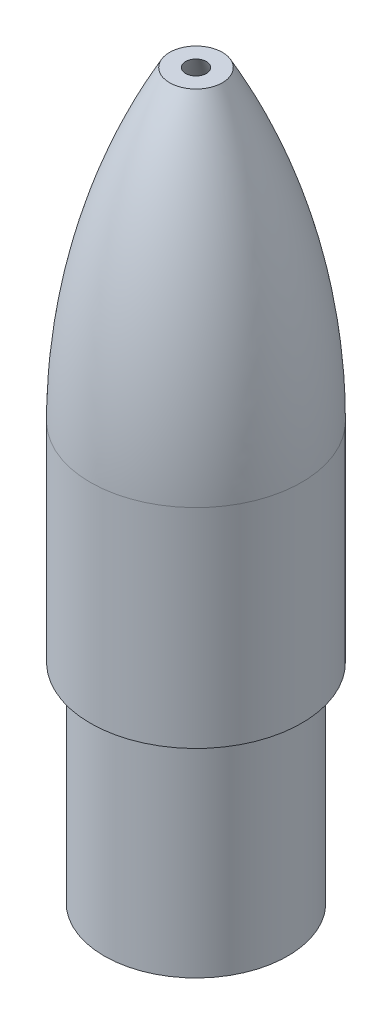
ISO-10303-21;
HEADER;
FILE_DESCRIPTION(('STEP AP214'),'2;1');
FILE_NAME('part.step','',(''),(''),'','','');
FILE_SCHEMA(('AUTOMOTIVE_DESIGN { 1 0 10303 214 1 1 1 1 }'));
ENDSEC;
DATA;
#1=APPLICATION_CONTEXT('core data for automotive mechanical design processes');
#2=APPLICATION_PROTOCOL_DEFINITION('international standard','automotive_design',2000,#1);
#3=PRODUCT_CONTEXT('',#1,'mechanical');
#4=PRODUCT('Part','Part','',(#3));
#5=PRODUCT_RELATED_PRODUCT_CATEGORY('part','',(#4));
#6=PRODUCT_DEFINITION_FORMATION('','',#4);
#7=PRODUCT_DEFINITION_CONTEXT('part definition',#1,'design');
#8=PRODUCT_DEFINITION('design','',#6,#7);
#9=PRODUCT_DEFINITION_SHAPE('','',#8);
#10=(LENGTH_UNIT() NAMED_UNIT(*) SI_UNIT(.MILLI.,.METRE.));
#11=(NAMED_UNIT(*) PLANE_ANGLE_UNIT() SI_UNIT($,.RADIAN.));
#12=(NAMED_UNIT(*) SI_UNIT($,.STERADIAN.) SOLID_ANGLE_UNIT());
#13=UNCERTAINTY_MEASURE_WITH_UNIT(LENGTH_MEASURE(1.E-05),#10,'distance_accuracy_value','');
#14=(GEOMETRIC_REPRESENTATION_CONTEXT(3) GLOBAL_UNCERTAINTY_ASSIGNED_CONTEXT((#13)) GLOBAL_UNIT_ASSIGNED_CONTEXT((#10,
#11,#12)) REPRESENTATION_CONTEXT('',''));
#15=CARTESIAN_POINT('',(0.,0.,0.));
#16=DIRECTION('',(0.,0.,1.));
#17=DIRECTION('',(1.,0.,0.));
#18=AXIS2_PLACEMENT_3D('',#15,#16,#17);
#19=CARTESIAN_POINT('',(-7.57031826638907,394.48786906456,0.));
#20=CARTESIAN_POINT('',(-7.40692368115789,394.240540683474,0.));
#21=CARTESIAN_POINT('',(-7.10622460252962,393.783996042679,0.));
#22=CARTESIAN_POINT('',(-6.5044083212627,392.866697934788,0.));
#23=CARTESIAN_POINT('',(-5.89646724451672,391.935964105759,0.));
#24=CARTESIAN_POINT('',(-5.34152102725264,391.081349612939,0.));
#25=CARTESIAN_POINT('',(-4.80065278131683,390.243806630745,0.));
#26=CARTESIAN_POINT('',(-4.07540431851941,389.11524640617,0.));
#27=CARTESIAN_POINT('',(-2.79835242174423,387.113712956422,0.));
#28=CARTESIAN_POINT('',(-1.00537089897089,384.260042493722,0.));
#29=CARTESIAN_POINT('',(3.24528166625921,377.356569284455,0.));
#30=CARTESIAN_POINT('',(12.1069861413526,362.199887033955,0.));
#31=CARTESIAN_POINT('',(29.3936990308607,328.534275171854,0.));
#32=CARTESIAN_POINT('',(48.7230697262519,277.933780444314,0.));
#33=CARTESIAN_POINT('',(60.4869787916709,225.059949931845,0.));
#34=CARTESIAN_POINT('',(64.6204865757033,187.441870001583,0.));
#35=CARTESIAN_POINT('',(65.5811558170411,169.911010474662,0.));
#36=CARTESIAN_POINT('',(65.8398472127782,161.807957387997,0.));
#37=CARTESIAN_POINT('',(65.9168272569417,158.438692592,0.));
#38=CARTESIAN_POINT('',(65.9545723983632,156.064661932005,0.));
#39=CARTESIAN_POINT('',(65.9715278265784,154.723430387071,0.));
#40=CARTESIAN_POINT('',(65.9819109186012,153.726401124678,0.));
#41=CARTESIAN_POINT('',(65.9899584510504,152.707134592282,0.));
#42=CARTESIAN_POINT('',(65.9957467251421,151.595575292547,0.));
#43=CARTESIAN_POINT('',(65.9992392418193,150.498770837124,0.));
#44=CARTESIAN_POINT('',(66.,149.951992082525,0.));
#45=CARTESIAN_POINT('',(66.,149.655549304778,0.));
#46=B_SPLINE_CURVE_WITH_KNOTS('',3,(#19,#20,#21,#22,#23,#24,#25,#26,#27,#28,#29,#30,#31,#32,#33,
#34,#35,#36,#37,#38,#39,#40,#41,#42,#43,#44,#45),.UNSPECIFIED.,.F.,.F.,(4,1,1,1,1,1,1,1,1,1,1,1,
1,1,1,1,1,1,1,1,1,1,1,1,4),(0.0826164282316582,0.085875877662812,0.0891353270939658,
0.0923947765251196,0.0956542259562734,0.0989136753874272,0.102173124818581,0.108692023680889,
0.121729821405504,0.134767619130119,0.18691881002858,0.291221191825501,0.499825955419344,
0.708430719013187,0.812733100810108,0.864884291708569,0.877922089433184,0.8909598871578,
0.897478786020107,0.900738235451261,0.903997684882415,0.907257134313568,0.910516583744722,
0.913776033175876,0.91703548260703),.UNSPECIFIED.);
#47=CARTESIAN_POINT('',(0.,-198.817850362013,0.));
#48=DIRECTION('',(0.,-1.,0.));
#49=AXIS1_PLACEMENT('',#47,#48);
#50=SURFACE_OF_REVOLUTION('',#46,#49);
#51=CARTESIAN_POINT('',(0.,370.000000000035,0.));
#52=DIRECTION('',(0.,-1.,0.));
#53=DIRECTION('',(0.,0.,-1.));
#54=AXIS2_PLACEMENT_3D('',#51,#52,#53);
#55=CIRCLE('',#54,7.4922004890449);
#56=CARTESIAN_POINT('',(0.,370.000000000035,-7.4922004890449));
#57=VERTEX_POINT('',#56);
#58=EDGE_CURVE('E87',#57,#57,#55,.T.);
#59=ORIENTED_EDGE('',*,*,#58,.F.);
#60=EDGE_LOOP('',(#59));
#61=FACE_BOUND('',#60,.T.);
#62=CARTESIAN_POINT('',(0.,149.65554930479,0.));
#63=DIRECTION('',(0.,1.,0.));
#64=DIRECTION('',(0.,0.,1.));
#65=AXIS2_PLACEMENT_3D('',#62,#63,#64);
#66=CIRCLE('',#65,66.);
#67=CARTESIAN_POINT('',(0.,149.65554930479,66.));
#68=VERTEX_POINT('',#67);
#69=EDGE_CURVE('E90',#68,#68,#66,.T.);
#70=ORIENTED_EDGE('',*,*,#69,.F.);
#71=EDGE_LOOP('',(#70));
#72=FACE_BOUND('',#71,.T.);
#73=ADVANCED_FACE('F33',(#61,#72),#50,.F.);
#74=CARTESIAN_POINT('',(66.,-0.344450695212162,0.));
#75=DIRECTION('',(0.,-1.,0.));
#76=DIRECTION('',(0.,0.,-1.));
#77=AXIS2_PLACEMENT_3D('',#74,#75,#76);
#78=PLANE('',#77);
#79=CARTESIAN_POINT('',(0.,-0.344450695212162,0.));
#80=DIRECTION('',(0.,-1.,0.));
#81=DIRECTION('',(0.,0.,-1.));
#82=AXIS2_PLACEMENT_3D('',#79,#80,#81);
#83=CIRCLE('',#82,76.);
#84=CARTESIAN_POINT('',(0.,-0.344450695212162,-76.));
#85=VERTEX_POINT('',#84);
#86=EDGE_CURVE('E41',#85,#85,#83,.T.);
#87=ORIENTED_EDGE('',*,*,#86,.T.);
#88=EDGE_LOOP('',(#87));
#89=FACE_BOUND('',#88,.T.);
#90=CARTESIAN_POINT('',(0.,-0.344450695212162,0.));
#91=DIRECTION('',(0.,-1.,0.));
#92=DIRECTION('',(0.,0.,-1.));
#93=AXIS2_PLACEMENT_3D('',#90,#91,#92);
#94=CIRCLE('',#93,66.);
#95=CARTESIAN_POINT('',(0.,-0.344450695212162,-66.));
#96=VERTEX_POINT('',#95);
#97=EDGE_CURVE('E10',#96,#96,#94,.T.);
#98=ORIENTED_EDGE('',*,*,#97,.F.);
#99=EDGE_LOOP('',(#98));
#100=FACE_BOUND('',#99,.T.);
#101=ADVANCED_FACE('F71',(#89,#100),#78,.T.);
#102=CARTESIAN_POINT('',(0.,-198.817850362013,0.));
#103=DIRECTION('',(0.,-1.,0.));
#104=DIRECTION('',(0.,0.,-1.));
#105=AXIS2_PLACEMENT_3D('',#102,#103,#104);
#106=CYLINDRICAL_SURFACE('',#105,76.0000000000219);
#107=CARTESIAN_POINT('',(0.,149.65554930479,0.));
#108=DIRECTION('',(0.,-1.,0.));
#109=DIRECTION('',(0.,0.,-1.));
#110=AXIS2_PLACEMENT_3D('',#107,#108,#109);
#111=CIRCLE('',#110,76.0000000000438);
#112=CARTESIAN_POINT('',(0.,149.65554930479,-76.0000000000438));
#113=VERTEX_POINT('',#112);
#114=EDGE_CURVE('E45',#113,#113,#111,.T.);
#115=ORIENTED_EDGE('',*,*,#114,.T.);
#116=EDGE_LOOP('',(#115));
#117=FACE_BOUND('',#116,.T.);
#118=ORIENTED_EDGE('',*,*,#86,.F.);
#119=EDGE_LOOP('',(#118));
#120=FACE_BOUND('',#119,.T.);
#121=ADVANCED_FACE('F67',(#117,#120),#106,.T.);
#122=CARTESIAN_POINT('',(0.773326773408387,400.000000000035,0.));
#123=CARTESIAN_POINT('',(0.980987300844179,399.685666804763,0.));
#124=CARTESIAN_POINT('',(1.39805930805779,399.052178662273,0.));
#125=CARTESIAN_POINT('',(2.28454116051532,397.700550841043,0.));
#126=CARTESIAN_POINT('',(3.25124134108879,396.211212549102,0.));
#127=CARTESIAN_POINT('',(4.21711650705912,394.710095548361,0.));
#128=CARTESIAN_POINT('',(5.19458242169875,393.178406868098,0.));
#129=CARTESIAN_POINT('',(6.15852967445228,391.654155139294,0.));
#130=CARTESIAN_POINT('',(7.11784195110237,390.123894265588,0.));
#131=CARTESIAN_POINT('',(8.07630334802307,388.581395306493,0.));
#132=CARTESIAN_POINT('',(9.03371941314947,387.026713905655,0.));
#133=CARTESIAN_POINT('',(16.9610419753638,374.037008418609,0.));
#134=CARTESIAN_POINT('',(28.5717826077035,353.014913090685,0.));
#135=CARTESIAN_POINT('',(42.416505118701,323.258697721467,0.));
#136=CARTESIAN_POINT('',(56.9252496614799,282.331206246475,0.));
#137=CARTESIAN_POINT('',(67.3740402556954,242.080254250157,0.));
#138=CARTESIAN_POINT('',(72.648534550497,209.220016815599,0.));
#139=CARTESIAN_POINT('',(74.8980107853338,183.923611768235,0.));
#140=CARTESIAN_POINT('',(75.5875350984228,169.173424135904,0.));
#141=CARTESIAN_POINT('',(75.711753268788,165.95563222155,0.));
#142=CARTESIAN_POINT('',(75.7992600647172,163.208321648723,0.));
#143=CARTESIAN_POINT('',(75.8497995073712,161.393000412241,0.));
#144=CARTESIAN_POINT('',(75.8928832135415,159.587415565472,0.));
#145=CARTESIAN_POINT('',(75.9287873428363,157.784317211172,0.));
#146=CARTESIAN_POINT('',(75.9575113275454,155.967426666443,0.));
#147=CARTESIAN_POINT('',(75.9790547134879,154.182939709568,0.));
#148=CARTESIAN_POINT('',(75.9934171600248,152.406482910103,0.));
#149=CARTESIAN_POINT('',(75.9988031200575,150.790982344528,0.));
#150=CARTESIAN_POINT('',(76.0000000000437,150.032282913949,0.));
#151=CARTESIAN_POINT('',(76.0000000000438,149.65554930479,0.));
#152=B_SPLINE_CURVE_WITH_KNOTS('',4,(#122,#123,#124,#125,#126,#127,#128,#129,#130,#131,#132,
#133,#134,#135,#136,#137,#138,#139,#140,#141,#142,#143,#144,#145,#146,#147,#148,#149,#150,#151),
.UNSPECIFIED.,.F.,.F.,(5,1,1,1,1,1,1,1,1,1,1,1,1,1,1,1,1,1,1,1,1,1,1,1,1,1,5),
(0.0826164282316582,0.088299706346032,0.0939829844604058,0.0996662625747796,0.105349540689153,
0.111032818803527,0.116716096917901,0.122399375032275,0.128082653146649,0.133891141901002,
0.139699630655356,0.313954310904782,0.430124091568336,0.546293874226719,0.68569761210705,
0.836718331478718,0.84833530900807,0.865760775302099,0.871569264066775,0.877252541384307,
0.882935818701838,0.88861909601937,0.894302373336902,0.899985650654434,0.905668927971966,
0.911352205289498,0.91703548260703),.UNSPECIFIED.);
#153=CARTESIAN_POINT('',(0.,-198.817850362013,0.));
#154=DIRECTION('',(0.,-1.,0.));
#155=AXIS1_PLACEMENT('',#153,#154);
#156=SURFACE_OF_REVOLUTION('',#152,#155);
#157=CARTESIAN_POINT('',(0.,370.000000000035,0.));
#158=DIRECTION('',(0.,-1.,0.));
#159=DIRECTION('',(0.,0.,-1.));
#160=AXIS2_PLACEMENT_3D('',#157,#158,#159);
#161=CIRCLE('',#160,18.9681519068156);
#162=CARTESIAN_POINT('',(0.,370.000000000035,-18.9681519068156));
#163=VERTEX_POINT('',#162);
#164=EDGE_CURVE('E37',#163,#163,#161,.T.);
#165=ORIENTED_EDGE('',*,*,#164,.T.);
#166=EDGE_LOOP('',(#165));
#167=FACE_BOUND('',#166,.T.);
#168=ORIENTED_EDGE('',*,*,#114,.F.);
#169=EDGE_LOOP('',(#168));
#170=FACE_BOUND('',#169,.T.);
#171=ADVANCED_FACE('F62',(#167,#170),#156,.T.);
#172=CARTESIAN_POINT('',(0.,-150.34445069521,0.));
#173=DIRECTION('',(0.,1.,0.));
#174=DIRECTION('',(0.,0.,1.));
#175=AXIS2_PLACEMENT_3D('',#172,#173,#174);
#176=CYLINDRICAL_SURFACE('',#175,66.);
#177=ORIENTED_EDGE('',*,*,#97,.T.);
#178=EDGE_LOOP('',(#177));
#179=FACE_BOUND('',#178,.T.);
#180=CARTESIAN_POINT('',(0.,-150.34445069521,0.));
#181=DIRECTION('',(0.,1.,0.));
#182=DIRECTION('',(0.,0.,1.));
#183=AXIS2_PLACEMENT_3D('',#180,#181,#182);
#184=CIRCLE('',#183,66.);
#185=CARTESIAN_POINT('',(0.,-150.34445069521,66.));
#186=VERTEX_POINT('',#185);
#187=EDGE_CURVE('E50',#186,#186,#184,.T.);
#188=ORIENTED_EDGE('',*,*,#187,.T.);
#189=EDGE_LOOP('',(#188));
#190=FACE_BOUND('',#189,.T.);
#191=ADVANCED_FACE('F66',(#179,#190),#176,.T.);
#192=CARTESIAN_POINT('',(0.,-150.34445069521,0.));
#193=DIRECTION('',(0.,1.,0.));
#194=DIRECTION('',(0.,0.,1.));
#195=AXIS2_PLACEMENT_3D('',#192,#193,#194);
#196=PLANE('',#195);
#197=CARTESIAN_POINT('',(0.,-150.34445069521,0.));
#198=DIRECTION('',(0.,1.,0.));
#199=DIRECTION('',(0.,0.,1.));
#200=AXIS2_PLACEMENT_3D('',#197,#198,#199);
#201=CIRCLE('',#200,58.);
#202=CARTESIAN_POINT('',(0.,-150.34445069521,58.));
#203=VERTEX_POINT('',#202);
#204=EDGE_CURVE('E92',#203,#203,#201,.T.);
#205=ORIENTED_EDGE('',*,*,#204,.T.);
#206=EDGE_LOOP('',(#205));
#207=FACE_BOUND('',#206,.T.);
#208=ORIENTED_EDGE('',*,*,#187,.F.);
#209=EDGE_LOOP('',(#208));
#210=FACE_BOUND('',#209,.T.);
#211=ADVANCED_FACE('F117',(#207,#210),#196,.F.);
#212=CARTESIAN_POINT('',(0.,149.65554930479,0.));
#213=DIRECTION('',(0.,1.,0.));
#214=DIRECTION('',(0.,0.,1.));
#215=AXIS2_PLACEMENT_3D('',#212,#213,#214);
#216=PLANE('',#215);
#217=CARTESIAN_POINT('',(0.,149.65554930479,0.));
#218=DIRECTION('',(0.,1.,0.));
#219=DIRECTION('',(0.,0.,1.));
#220=AXIS2_PLACEMENT_3D('',#217,#218,#219);
#221=CIRCLE('',#220,58.);
#222=CARTESIAN_POINT('',(0.,149.65554930479,58.));
#223=VERTEX_POINT('',#222);
#224=EDGE_CURVE('E96',#223,#223,#221,.T.);
#225=ORIENTED_EDGE('',*,*,#224,.F.);
#226=EDGE_LOOP('',(#225));
#227=FACE_BOUND('',#226,.T.);
#228=ORIENTED_EDGE('',*,*,#69,.T.);
#229=EDGE_LOOP('',(#228));
#230=FACE_BOUND('',#229,.T.);
#231=ADVANCED_FACE('F113',(#227,#230),#216,.T.);
#232=CARTESIAN_POINT('',(0.,-150.34445069521,0.));
#233=DIRECTION('',(0.,1.,0.));
#234=DIRECTION('',(0.,0.,1.));
#235=AXIS2_PLACEMENT_3D('',#232,#233,#234);
#236=CYLINDRICAL_SURFACE('',#235,58.);
#237=ORIENTED_EDGE('',*,*,#204,.F.);
#238=EDGE_LOOP('',(#237));
#239=FACE_BOUND('',#238,.T.);
#240=ORIENTED_EDGE('',*,*,#224,.T.);
#241=EDGE_LOOP('',(#240));
#242=FACE_BOUND('',#241,.T.);
#243=ADVANCED_FACE('F108',(#239,#242),#236,.F.);
#244=CARTESIAN_POINT('',(0.,370.000000000035,0.));
#245=DIRECTION('',(0.,-1.,0.));
#246=DIRECTION('',(1.,0.,0.));
#247=AXIS2_PLACEMENT_3D('',#244,#245,#246);
#248=PLANE('',#247);
#249=ORIENTED_EDGE('',*,*,#58,.T.);
#250=EDGE_LOOP('',(#249));
#251=FACE_BOUND('',#250,.T.);
#252=ORIENTED_EDGE('',*,*,#164,.F.);
#253=EDGE_LOOP('',(#252));
#254=FACE_BOUND('',#253,.T.);
#255=ADVANCED_FACE('F106',(#251,#254),#248,.F.);
#256=CLOSED_SHELL('',(#73,#101,#121,#171,#191,#211,#231,#243,#255));
#257=MANIFOLD_SOLID_BREP('B2',#256);
#258=ADVANCED_BREP_SHAPE_REPRESENTATION('',(#18,#257),#14);
#259=SHAPE_DEFINITION_REPRESENTATION(#9,#258);
ENDSEC;
END-ISO-10303-21;
